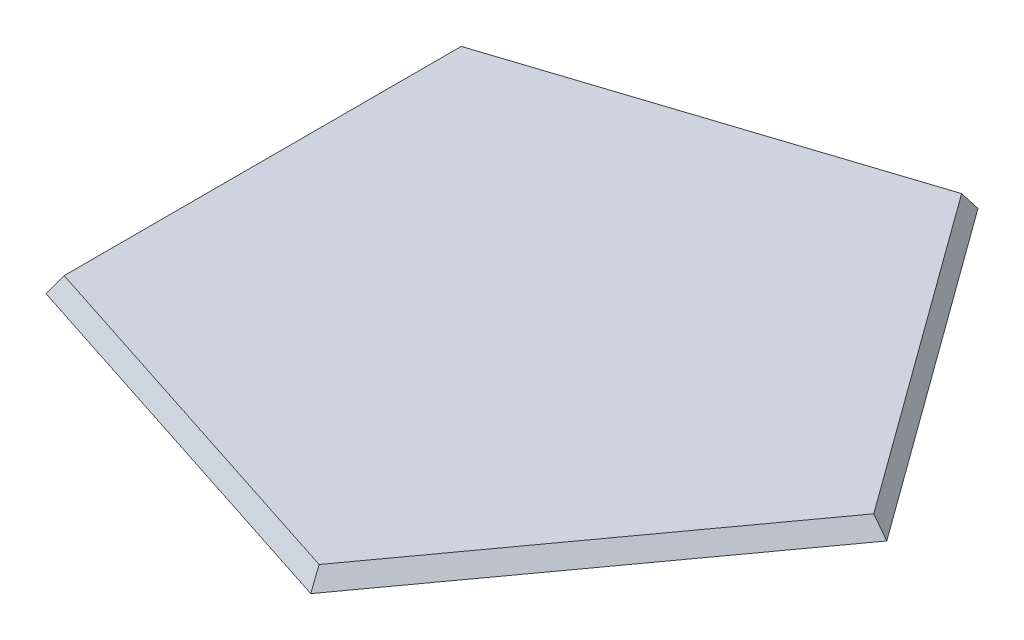
ISO-10303-21;
HEADER;
FILE_DESCRIPTION(('STEP AP214'),'2;1');
FILE_NAME('part.step','',(''),(''),'','','');
FILE_SCHEMA(('AUTOMOTIVE_DESIGN { 1 0 10303 214 1 1 1 1 }'));
ENDSEC;
DATA;
#1=APPLICATION_CONTEXT('core data for automotive mechanical design processes');
#2=APPLICATION_PROTOCOL_DEFINITION('international standard','automotive_design',2000,#1);
#3=PRODUCT_CONTEXT('',#1,'mechanical');
#4=PRODUCT('Part','Part','',(#3));
#5=PRODUCT_RELATED_PRODUCT_CATEGORY('part','',(#4));
#6=PRODUCT_DEFINITION_FORMATION('','',#4);
#7=PRODUCT_DEFINITION_CONTEXT('part definition',#1,'design');
#8=PRODUCT_DEFINITION('design','',#6,#7);
#9=PRODUCT_DEFINITION_SHAPE('','',#8);
#10=(LENGTH_UNIT() NAMED_UNIT(*) SI_UNIT(.MILLI.,.METRE.));
#11=(NAMED_UNIT(*) PLANE_ANGLE_UNIT() SI_UNIT($,.RADIAN.));
#12=(NAMED_UNIT(*) SI_UNIT($,.STERADIAN.) SOLID_ANGLE_UNIT());
#13=UNCERTAINTY_MEASURE_WITH_UNIT(LENGTH_MEASURE(1.E-05),#10,'distance_accuracy_value','');
#14=(GEOMETRIC_REPRESENTATION_CONTEXT(3) GLOBAL_UNCERTAINTY_ASSIGNED_CONTEXT((#13)) GLOBAL_UNIT_ASSIGNED_CONTEXT((#10,
#11,#12)) REPRESENTATION_CONTEXT('',''));
#15=CARTESIAN_POINT('',(0.,0.,0.));
#16=DIRECTION('',(0.,0.,1.));
#17=DIRECTION('',(1.,0.,0.));
#18=AXIS2_PLACEMENT_3D('',#15,#16,#17);
#19=CARTESIAN_POINT('',(0.,3.,0.));
#20=DIRECTION('',(0.,1.,0.));
#21=DIRECTION('',(0.,0.,1.));
#22=AXIS2_PLACEMENT_3D('',#19,#20,#21);
#23=PLANE('',#22);
#24=DIRECTION('',(-0.951056516295154,0.,0.309016994374947));
#25=VECTOR('',#24,1.);
#26=CARTESIAN_POINT('',(-49.4271063103228,3.,-34.5639409229969));
#27=LINE('',#26,#25);
#28=CARTESIAN_POINT('',(18.3901650181835,3.,-56.5991081223997));
#29=VERTEX_POINT('',#28);
#30=CARTESIAN_POINT('',(-48.1460770763238,3.,-34.9801725525733));
#31=VERTEX_POINT('',#30);
#32=EDGE_CURVE('E42',#29,#31,#27,.T.);
#33=ORIENTED_EDGE('',*,*,#32,.T.);
#34=DIRECTION('',(0.,0.,1.));
#35=VECTOR('',#34,1.);
#36=CARTESIAN_POINT('',(-48.1460770763238,3.,36.3271264002681));
#37=LINE('',#36,#35);
#38=CARTESIAN_POINT('',(-48.1460770763238,3.,34.9801725525733));
#39=VERTEX_POINT('',#38);
#40=EDGE_CURVE('E11',#31,#39,#37,.T.);
#41=ORIENTED_EDGE('',*,*,#40,.T.);
#42=DIRECTION('',(0.951056516295154,0.,0.309016994374948));
#43=VECTOR('',#42,1.);
#44=CARTESIAN_POINT('',(19.6711942521825,3.,57.0153397519762));
#45=LINE('',#44,#43);
#46=CARTESIAN_POINT('',(18.3901650181836,3.,56.5991081223997));
#47=VERTEX_POINT('',#46);
#48=EDGE_CURVE('E116',#39,#47,#45,.T.);
#49=ORIENTED_EDGE('',*,*,#48,.T.);
#50=DIRECTION('',(0.587785252292473,0.,-0.809016994374948));
#51=VECTOR('',#50,1.);
#52=CARTESIAN_POINT('',(60.3035437234742,3.,-1.08970855342381));
#53=LINE('',#52,#51);
#54=CARTESIAN_POINT('',(59.5118241162806,3.,0.));
#55=VERTEX_POINT('',#54);
#56=EDGE_CURVE('E96',#47,#55,#53,.T.);
#57=ORIENTED_EDGE('',*,*,#56,.T.);
#58=DIRECTION('',(-0.587785252292473,0.,-0.809016994374948));
#59=VECTOR('',#58,1.);
#60=CARTESIAN_POINT('',(17.5984454109899,3.,-57.6888166758236));
#61=LINE('',#60,#59);
#62=EDGE_CURVE('E53',#55,#29,#61,.T.);
#63=ORIENTED_EDGE('',*,*,#62,.T.);
#64=EDGE_LOOP('',(#33,#41,#49,#57,#63));
#65=FACE_BOUND('',#64,.T.);
#66=ADVANCED_FACE('F33',(#65),#23,.T.);
#67=CARTESIAN_POINT('',(0.,0.,0.));
#68=DIRECTION('',(0.,1.,0.));
#69=DIRECTION('',(0.,0.,1.));
#70=AXIS2_PLACEMENT_3D('',#67,#68,#69);
#71=PLANE('',#70);
#72=CARTESIAN_POINT('',(54.3869910099908,0.,0.));
#73=DIRECTION('',(0.,-1.,0.));
#74=DIRECTION('',(0.,0.,-1.));
#75=AXIS2_PLACEMENT_3D('',#72,#73,#74);
#76=CIRCLE('',#75,2.);
#77=CARTESIAN_POINT('',(54.3869910099908,0.,-1.99999999999998));
#78=VERTEX_POINT('',#77);
#79=EDGE_CURVE('E290',#78,#78,#76,.T.);
#80=ORIENTED_EDGE('',*,*,#79,.F.);
#81=EDGE_LOOP('',(#80));
#82=FACE_BOUND('',#81,.T.);
#83=CARTESIAN_POINT('',(16.8065044950047,0.,51.7251022017377));
#84=DIRECTION('',(0.,-1.,0.));
#85=DIRECTION('',(0.,0.,-1.));
#86=AXIS2_PLACEMENT_3D('',#83,#84,#85);
#87=CIRCLE('',#86,2.00000000000001);
#88=CARTESIAN_POINT('',(16.8065044950047,0.,49.7251022017377));
#89=VERTEX_POINT('',#88);
#90=EDGE_CURVE('E289',#89,#89,#87,.T.);
#91=ORIENTED_EDGE('',*,*,#90,.F.);
#92=EDGE_LOOP('',(#91));
#93=FACE_BOUND('',#92,.T.);
#94=CARTESIAN_POINT('',(-44.0000000000001,0.,31.9678712322359));
#95=DIRECTION('',(0.,-1.,0.));
#96=DIRECTION('',(0.,0.,-1.));
#97=AXIS2_PLACEMENT_3D('',#94,#95,#96);
#98=CIRCLE('',#97,2.);
#99=CARTESIAN_POINT('',(-44.0000000000001,0.,29.9678712322359));
#100=VERTEX_POINT('',#99);
#101=EDGE_CURVE('E297',#100,#100,#98,.T.);
#102=ORIENTED_EDGE('',*,*,#101,.F.);
#103=EDGE_LOOP('',(#102));
#104=FACE_BOUND('',#103,.T.);
#105=CARTESIAN_POINT('',(-44.0000000000001,0.,-31.9678712322359));
#106=DIRECTION('',(0.,-1.,0.));
#107=DIRECTION('',(0.,0.,-1.));
#108=AXIS2_PLACEMENT_3D('',#105,#106,#107);
#109=CIRCLE('',#108,2.);
#110=CARTESIAN_POINT('',(-44.0000000000001,0.,-33.9678712322359));
#111=VERTEX_POINT('',#110);
#112=EDGE_CURVE('E303',#111,#111,#109,.T.);
#113=ORIENTED_EDGE('',*,*,#112,.F.);
#114=EDGE_LOOP('',(#113));
#115=FACE_BOUND('',#114,.T.);
#116=CARTESIAN_POINT('',(16.8065044950046,0.,-51.7251022017377));
#117=DIRECTION('',(0.,-1.,0.));
#118=DIRECTION('',(0.,0.,-1.));
#119=AXIS2_PLACEMENT_3D('',#116,#117,#118);
#120=CIRCLE('',#119,2.00000000000001);
#121=CARTESIAN_POINT('',(16.8065044950046,0.,-53.7251022017377));
#122=VERTEX_POINT('',#121);
#123=EDGE_CURVE('E107',#122,#122,#120,.T.);
#124=ORIENTED_EDGE('',*,*,#123,.F.);
#125=EDGE_LOOP('',(#124));
#126=FACE_BOUND('',#125,.T.);
#127=DIRECTION('',(0.951056516295154,0.,0.309016994374948));
#128=VECTOR('',#127,1.);
#129=CARTESIAN_POINT('',(-50.0000000000001,0.,36.3271264002681));
#130=LINE('',#129,#128);
#131=CARTESIAN_POINT('',(-50.0000000000001,0.,36.3271264002681));
#132=VERTEX_POINT('',#131);
#133=CARTESIAN_POINT('',(19.0983005625053,0.,58.7785252292474));
#134=VERTEX_POINT('',#133);
#135=EDGE_CURVE('E84',#132,#134,#130,.T.);
#136=ORIENTED_EDGE('',*,*,#135,.F.);
#137=DIRECTION('',(0.,0.,1.));
#138=VECTOR('',#137,1.);
#139=CARTESIAN_POINT('',(-50.0000000000001,0.,-36.3271264002681));
#140=LINE('',#139,#138);
#141=CARTESIAN_POINT('',(-50.0000000000001,0.,-36.3271264002681));
#142=VERTEX_POINT('',#141);
#143=EDGE_CURVE('E114',#142,#132,#140,.T.);
#144=ORIENTED_EDGE('',*,*,#143,.F.);
#145=DIRECTION('',(-0.951056516295154,0.,0.309016994374947));
#146=VECTOR('',#145,1.);
#147=CARTESIAN_POINT('',(19.0983005625053,0.,-58.7785252292474));
#148=LINE('',#147,#146);
#149=CARTESIAN_POINT('',(19.0983005625053,0.,-58.7785252292474));
#150=VERTEX_POINT('',#149);
#151=EDGE_CURVE('E111',#150,#142,#148,.T.);
#152=ORIENTED_EDGE('',*,*,#151,.F.);
#153=DIRECTION('',(-0.587785252292473,0.,-0.809016994374948));
#154=VECTOR('',#153,1.);
#155=CARTESIAN_POINT('',(61.8033988749896,0.,0.));
#156=LINE('',#155,#154);
#157=CARTESIAN_POINT('',(61.8033988749896,0.,0.));
#158=VERTEX_POINT('',#157);
#159=EDGE_CURVE('E87',#158,#150,#156,.T.);
#160=ORIENTED_EDGE('',*,*,#159,.F.);
#161=DIRECTION('',(0.587785252292473,0.,-0.809016994374947));
#162=VECTOR('',#161,1.);
#163=CARTESIAN_POINT('',(19.0983005625053,0.,58.7785252292474));
#164=LINE('',#163,#162);
#165=EDGE_CURVE('E79',#134,#158,#164,.T.);
#166=ORIENTED_EDGE('',*,*,#165,.F.);
#167=EDGE_LOOP('',(#136,#144,#152,#160,#166));
#168=FACE_BOUND('',#167,.T.);
#169=ADVANCED_FACE('F81',(#82,#93,#104,#115,#126,#168),#71,.F.);
#170=CARTESIAN_POINT('',(38.9509945672321,3.,-28.2995540611998));
#171=DIRECTION('',(0.688209327963416,0.525694374889675,-0.50001334493541));
#172=DIRECTION('',(0.587785252292473,0.,0.809016994374948));
#173=AXIS2_PLACEMENT_3D('',#170,#171,#172);
#174=PLANE('',#173);
#175=DIRECTION('',(-0.187581034297648,0.794682751636108,0.577315061144164));
#176=VECTOR('',#175,1.);
#177=CARTESIAN_POINT('',(16.0489779260172,12.9183854458629,-49.3936751513923));
#178=LINE('',#177,#176);
#179=EDGE_CURVE('E99',#29,#150,#178,.F.);
#180=ORIENTED_EDGE('',*,*,#179,.F.);
#181=ORIENTED_EDGE('',*,*,#62,.F.);
#182=DIRECTION('',(-0.607024978276895,0.794682751636107,0.));
#183=VECTOR('',#182,1.);
#184=CARTESIAN_POINT('',(51.9355835379852,12.918385445863,0.));
#185=LINE('',#184,#183);
#186=EDGE_CURVE('E37',#158,#55,#185,.T.);
#187=ORIENTED_EDGE('',*,*,#186,.F.);
#188=ORIENTED_EDGE('',*,*,#159,.T.);
#189=EDGE_LOOP('',(#180,#181,#187,#188));
#190=FACE_BOUND('',#189,.T.);
#191=ADVANCED_FACE('F35',(#190),#174,.T.);
#192=CARTESIAN_POINT('',(38.9509945672321,3.,28.2995540611999));
#193=DIRECTION('',(0.688209327963417,0.525694374889672,0.500013344935411));
#194=DIRECTION('',(-0.587785252292473,0.,0.809016994374948));
#195=AXIS2_PLACEMENT_3D('',#192,#193,#194);
#196=PLANE('',#195);
#197=ORIENTED_EDGE('',*,*,#186,.T.);
#198=ORIENTED_EDGE('',*,*,#56,.F.);
#199=DIRECTION('',(-0.187581034297645,0.794682751636109,-0.577315061144162));
#200=VECTOR('',#199,1.);
#201=CARTESIAN_POINT('',(16.0489779260172,12.918385445863,49.3936751513923));
#202=LINE('',#201,#200);
#203=EDGE_CURVE('E94',#134,#47,#202,.T.);
#204=ORIENTED_EDGE('',*,*,#203,.F.);
#205=ORIENTED_EDGE('',*,*,#165,.T.);
#206=EDGE_LOOP('',(#197,#198,#204,#205));
#207=FACE_BOUND('',#206,.T.);
#208=ADVANCED_FACE('F95',(#207),#196,.T.);
#209=CARTESIAN_POINT('',(-14.8779560290702,3.,-45.7896403374865));
#210=DIRECTION('',(-0.262872571907302,0.525694374889672,-0.809038586934021));
#211=DIRECTION('',(0.951056516295154,0.,-0.309016994374947));
#212=AXIS2_PLACEMENT_3D('',#209,#210,#211);
#213=PLANE('',#212);
#214=ORIENTED_EDGE('',*,*,#179,.T.);
#215=ORIENTED_EDGE('',*,*,#151,.T.);
#216=DIRECTION('',(0.491093523436089,0.794682751636109,0.356800330004317));
#217=VECTOR('',#216,1.);
#218=CARTESIAN_POINT('',(-42.0167696950099,12.9183854458629,-30.5269700728316));
#219=LINE('',#218,#217);
#220=EDGE_CURVE('E100',#31,#142,#219,.F.);
#221=ORIENTED_EDGE('',*,*,#220,.F.);
#222=ORIENTED_EDGE('',*,*,#32,.F.);
#223=EDGE_LOOP('',(#214,#215,#221,#222));
#224=FACE_BOUND('',#223,.T.);
#225=ADVANCED_FACE('F125',(#224),#213,.T.);
#226=CARTESIAN_POINT('',(-14.8779560290702,3.,45.7896403374865));
#227=DIRECTION('',(-0.262872571907302,0.52569437488967,0.809038586934022));
#228=DIRECTION('',(-0.951056516295154,0.,-0.309016994374948));
#229=AXIS2_PLACEMENT_3D('',#226,#227,#228);
#230=PLANE('',#229);
#231=ORIENTED_EDGE('',*,*,#203,.T.);
#232=ORIENTED_EDGE('',*,*,#48,.F.);
#233=DIRECTION('',(-0.491093523436089,-0.79468275163611,0.356800330004315));
#234=VECTOR('',#233,1.);
#235=CARTESIAN_POINT('',(-42.0167696950099,12.918385445863,30.5269700728316));
#236=LINE('',#235,#234);
#237=EDGE_CURVE('E104',#132,#39,#236,.F.);
#238=ORIENTED_EDGE('',*,*,#237,.F.);
#239=ORIENTED_EDGE('',*,*,#135,.T.);
#240=EDGE_LOOP('',(#231,#232,#238,#239));
#241=FACE_BOUND('',#240,.T.);
#242=ADVANCED_FACE('F103',(#241),#230,.T.);
#243=CARTESIAN_POINT('',(-48.1460770763238,3.,0.));
#244=DIRECTION('',(-0.850673512112231,0.525694374889671,0.));
#245=DIRECTION('',(0.,0.,-1.));
#246=AXIS2_PLACEMENT_3D('',#243,#244,#245);
#247=PLANE('',#246);
#248=ORIENTED_EDGE('',*,*,#220,.T.);
#249=ORIENTED_EDGE('',*,*,#143,.T.);
#250=ORIENTED_EDGE('',*,*,#237,.T.);
#251=ORIENTED_EDGE('',*,*,#40,.F.);
#252=EDGE_LOOP('',(#248,#249,#250,#251));
#253=FACE_BOUND('',#252,.T.);
#254=ADVANCED_FACE('F142',(#253),#247,.T.);
#255=CARTESIAN_POINT('',(16.5251329435582,1.19202412745416,-50.8591296100215));
#256=DIRECTION('',(0.,-1.,0.));
#257=DIRECTION('',(0.,0.,-1.));
#258=AXIS2_PLACEMENT_3D('',#255,#256,#257);
#259=CIRCLE('',#258,2.00000000000001);
#260=DIRECTION('',(0.187581034297648,-0.794682751636105,-0.577315061144167));
#261=VECTOR('',#260,1.);
#262=SURFACE_OF_LINEAR_EXTRUSION('',#259,#261);
#263=CARTESIAN_POINT('',(16.5251329435582,1.19202412745416,-52.8591296100215));
#264=VERTEX_POINT('',#263);
#265=EDGE_CURVE('E122',#264,#264,#259,.T.);
#266=ORIENTED_EDGE('',*,*,#265,.F.);
#267=EDGE_LOOP('',(#266));
#268=FACE_BOUND('',#267,.T.);
#269=ORIENTED_EDGE('',*,*,#123,.T.);
#270=EDGE_LOOP('',(#269));
#271=FACE_BOUND('',#270,.T.);
#272=ADVANCED_FACE('F139',(#268,#271),#262,.F.);
#273=CARTESIAN_POINT('',(16.5251329435582,1.19202412745416,-50.8591296100215));
#274=DIRECTION('',(0.,-1.,0.));
#275=DIRECTION('',(0.,0.,-1.));
#276=AXIS2_PLACEMENT_3D('',#273,#274,#275);
#277=PLANE('',#276);
#278=ORIENTED_EDGE('',*,*,#265,.T.);
#279=EDGE_LOOP('',(#278));
#280=FACE_BOUND('',#279,.T.);
#281=ADVANCED_FACE('F167',(#280),#277,.T.);
#282=CARTESIAN_POINT('',(-43.2633597148459,1.19202412745416,-31.4326707372295));
#283=DIRECTION('',(0.,-1.,0.));
#284=DIRECTION('',(0.,0.,-1.));
#285=AXIS2_PLACEMENT_3D('',#282,#283,#284);
#286=CIRCLE('',#285,2.);
#287=DIRECTION('',(-0.491093523436093,-0.794682751636106,-0.356800330004319));
#288=VECTOR('',#287,1.);
#289=SURFACE_OF_LINEAR_EXTRUSION('',#286,#288);
#290=CARTESIAN_POINT('',(-43.2633597148459,1.19202412745416,-33.4326707372295));
#291=VERTEX_POINT('',#290);
#292=EDGE_CURVE('E306',#291,#291,#286,.T.);
#293=ORIENTED_EDGE('',*,*,#292,.F.);
#294=EDGE_LOOP('',(#293));
#295=FACE_BOUND('',#294,.T.);
#296=ORIENTED_EDGE('',*,*,#112,.T.);
#297=EDGE_LOOP('',(#296));
#298=FACE_BOUND('',#297,.T.);
#299=ADVANCED_FACE('F174',(#295,#298),#289,.F.);
#300=CARTESIAN_POINT('',(-43.2633597148459,1.19202412745416,-31.4326707372295));
#301=DIRECTION('',(0.,-1.,0.));
#302=DIRECTION('',(0.,0.,-1.));
#303=AXIS2_PLACEMENT_3D('',#300,#301,#302);
#304=PLANE('',#303);
#305=ORIENTED_EDGE('',*,*,#292,.T.);
#306=EDGE_LOOP('',(#305));
#307=FACE_BOUND('',#306,.T.);
#308=ADVANCED_FACE('F181',(#307),#304,.T.);
#309=CARTESIAN_POINT('',(-43.2633597148459,1.19202412745416,31.4326707372294));
#310=DIRECTION('',(0.,-1.,0.));
#311=DIRECTION('',(0.,0.,-1.));
#312=AXIS2_PLACEMENT_3D('',#309,#310,#311);
#313=CIRCLE('',#312,2.);
#314=DIRECTION('',(-0.491093523436093,-0.794682751636106,0.356800330004319));
#315=VECTOR('',#314,1.);
#316=SURFACE_OF_LINEAR_EXTRUSION('',#313,#315);
#317=CARTESIAN_POINT('',(-43.2633597148459,1.19202412745416,29.4326707372294));
#318=VERTEX_POINT('',#317);
#319=EDGE_CURVE('E299',#318,#318,#313,.T.);
#320=ORIENTED_EDGE('',*,*,#319,.F.);
#321=EDGE_LOOP('',(#320));
#322=FACE_BOUND('',#321,.T.);
#323=ORIENTED_EDGE('',*,*,#101,.T.);
#324=EDGE_LOOP('',(#323));
#325=FACE_BOUND('',#324,.T.);
#326=ADVANCED_FACE('F189',(#322,#325),#316,.F.);
#327=CARTESIAN_POINT('',(-43.2633597148459,1.19202412745416,31.4326707372294));
#328=DIRECTION('',(0.,-1.,0.));
#329=DIRECTION('',(0.,0.,-1.));
#330=AXIS2_PLACEMENT_3D('',#327,#328,#329);
#331=PLANE('',#330);
#332=ORIENTED_EDGE('',*,*,#319,.T.);
#333=EDGE_LOOP('',(#332));
#334=FACE_BOUND('',#333,.T.);
#335=ADVANCED_FACE('F197',(#334),#331,.T.);
#336=CARTESIAN_POINT('',(16.5251329435582,1.19202412745416,50.8591296100215));
#337=DIRECTION('',(0.,-1.,0.));
#338=DIRECTION('',(0.,0.,-1.));
#339=AXIS2_PLACEMENT_3D('',#336,#337,#338);
#340=CIRCLE('',#339,2.00000000000001);
#341=DIRECTION('',(0.187581034297645,-0.794682751636106,0.577315061144166));
#342=VECTOR('',#341,1.);
#343=SURFACE_OF_LINEAR_EXTRUSION('',#340,#342);
#344=CARTESIAN_POINT('',(16.5251329435582,1.19202412745416,48.8591296100215));
#345=VERTEX_POINT('',#344);
#346=EDGE_CURVE('E293',#345,#345,#340,.T.);
#347=ORIENTED_EDGE('',*,*,#346,.F.);
#348=EDGE_LOOP('',(#347));
#349=FACE_BOUND('',#348,.T.);
#350=ORIENTED_EDGE('',*,*,#90,.T.);
#351=EDGE_LOOP('',(#350));
#352=FACE_BOUND('',#351,.T.);
#353=ADVANCED_FACE('F205',(#349,#352),#343,.F.);
#354=CARTESIAN_POINT('',(16.5251329435582,1.19202412745416,50.8591296100215));
#355=DIRECTION('',(0.,-1.,0.));
#356=DIRECTION('',(0.,0.,-1.));
#357=AXIS2_PLACEMENT_3D('',#354,#355,#356);
#358=PLANE('',#357);
#359=ORIENTED_EDGE('',*,*,#346,.T.);
#360=EDGE_LOOP('',(#359));
#361=FACE_BOUND('',#360,.T.);
#362=ADVANCED_FACE('F213',(#361),#358,.T.);
#363=CARTESIAN_POINT('',(53.4764535425755,1.19202412745416,0.));
#364=DIRECTION('',(0.,-1.,0.));
#365=DIRECTION('',(0.,0.,-1.));
#366=AXIS2_PLACEMENT_3D('',#363,#364,#365);
#367=CIRCLE('',#366,2.);
#368=DIRECTION('',(0.607024978276897,-0.794682751636105,0.));
#369=VECTOR('',#368,1.);
#370=SURFACE_OF_LINEAR_EXTRUSION('',#367,#369);
#371=CARTESIAN_POINT('',(53.4764535425755,1.19202412745416,-1.99999999999998));
#372=VERTEX_POINT('',#371);
#373=EDGE_CURVE('E286',#372,#372,#367,.T.);
#374=ORIENTED_EDGE('',*,*,#373,.F.);
#375=EDGE_LOOP('',(#374));
#376=FACE_BOUND('',#375,.T.);
#377=ORIENTED_EDGE('',*,*,#79,.T.);
#378=EDGE_LOOP('',(#377));
#379=FACE_BOUND('',#378,.T.);
#380=ADVANCED_FACE('F221',(#376,#379),#370,.F.);
#381=CARTESIAN_POINT('',(53.4764535425755,1.19202412745416,0.));
#382=DIRECTION('',(0.,-1.,0.));
#383=DIRECTION('',(0.,0.,-1.));
#384=AXIS2_PLACEMENT_3D('',#381,#382,#383);
#385=PLANE('',#384);
#386=ORIENTED_EDGE('',*,*,#373,.T.);
#387=EDGE_LOOP('',(#386));
#388=FACE_BOUND('',#387,.T.);
#389=ADVANCED_FACE('F230',(#388),#385,.T.);
#390=CLOSED_SHELL('',(#66,#169,#191,#208,#225,#242,#254,#272,#281,#299,#308,#326,#335,#353,#362,
#380,#389));
#391=MANIFOLD_SOLID_BREP('B2',#390);
#392=ADVANCED_BREP_SHAPE_REPRESENTATION('',(#18,#391),#14);
#393=SHAPE_DEFINITION_REPRESENTATION(#9,#392);
ENDSEC;
END-ISO-10303-21;
